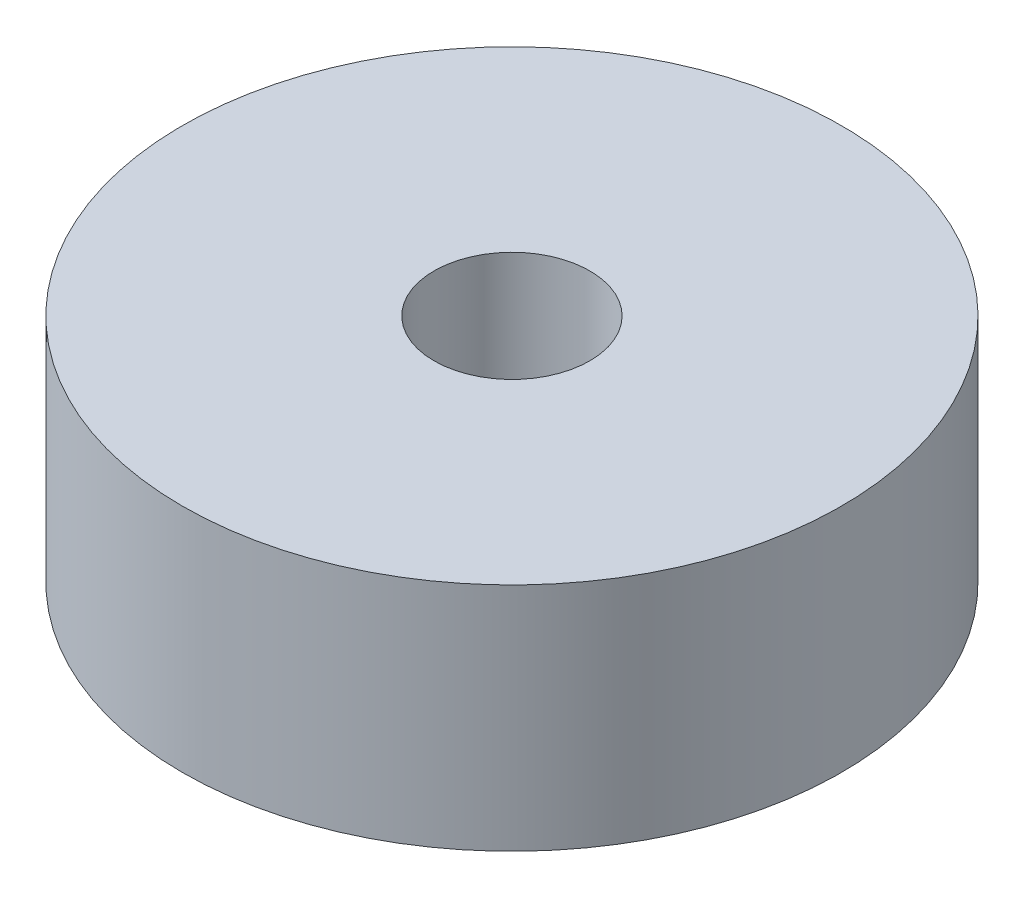
ISO-10303-21;
HEADER;
FILE_DESCRIPTION(('STEP AP214'),'2;1');
FILE_NAME('part.step','',(''),(''),'','','');
FILE_SCHEMA(('AUTOMOTIVE_DESIGN { 1 0 10303 214 1 1 1 1 }'));
ENDSEC;
DATA;
#1=APPLICATION_CONTEXT('core data for automotive mechanical design processes');
#2=APPLICATION_PROTOCOL_DEFINITION('international standard','automotive_design',2000,#1);
#3=PRODUCT_CONTEXT('',#1,'mechanical');
#4=PRODUCT('Part','Part','',(#3));
#5=PRODUCT_RELATED_PRODUCT_CATEGORY('part','',(#4));
#6=PRODUCT_DEFINITION_FORMATION('','',#4);
#7=PRODUCT_DEFINITION_CONTEXT('part definition',#1,'design');
#8=PRODUCT_DEFINITION('design','',#6,#7);
#9=PRODUCT_DEFINITION_SHAPE('','',#8);
#10=(LENGTH_UNIT() NAMED_UNIT(*) SI_UNIT(.MILLI.,.METRE.));
#11=(NAMED_UNIT(*) PLANE_ANGLE_UNIT() SI_UNIT($,.RADIAN.));
#12=(NAMED_UNIT(*) SI_UNIT($,.STERADIAN.) SOLID_ANGLE_UNIT());
#13=UNCERTAINTY_MEASURE_WITH_UNIT(LENGTH_MEASURE(1.E-05),#10,'distance_accuracy_value','');
#14=(GEOMETRIC_REPRESENTATION_CONTEXT(3) GLOBAL_UNCERTAINTY_ASSIGNED_CONTEXT((#13)) GLOBAL_UNIT_ASSIGNED_CONTEXT((#10,
#11,#12)) REPRESENTATION_CONTEXT('',''));
#15=CARTESIAN_POINT('',(0.,0.,0.));
#16=DIRECTION('',(0.,0.,1.));
#17=DIRECTION('',(1.,0.,0.));
#18=AXIS2_PLACEMENT_3D('',#15,#16,#17);
#19=CARTESIAN_POINT('',(0.,0.,0.));
#20=DIRECTION('',(0.,1.,0.));
#21=DIRECTION('',(0.,0.,1.));
#22=AXIS2_PLACEMENT_3D('',#19,#20,#21);
#23=PLANE('',#22);
#24=CARTESIAN_POINT('',(0.,0.,0.));
#25=DIRECTION('',(0.,1.,0.));
#26=DIRECTION('',(0.,0.,1.));
#27=AXIS2_PLACEMENT_3D('',#24,#25,#26);
#28=CIRCLE('',#27,14.2875);
#29=CARTESIAN_POINT('',(0.,0.,14.2875));
#30=VERTEX_POINT('',#29);
#31=EDGE_CURVE('E41',#30,#30,#28,.T.);
#32=ORIENTED_EDGE('',*,*,#31,.F.);
#33=EDGE_LOOP('',(#32));
#34=FACE_BOUND('',#33,.T.);
#35=CARTESIAN_POINT('',(0.,0.,0.));
#36=DIRECTION('',(0.,1.,0.));
#37=DIRECTION('',(0.,0.,1.));
#38=AXIS2_PLACEMENT_3D('',#35,#36,#37);
#39=CIRCLE('',#38,3.3782);
#40=CARTESIAN_POINT('',(0.,0.,3.3782));
#41=VERTEX_POINT('',#40);
#42=EDGE_CURVE('E48',#41,#41,#39,.F.);
#43=ORIENTED_EDGE('',*,*,#42,.F.);
#44=EDGE_LOOP('',(#43));
#45=FACE_BOUND('',#44,.T.);
#46=ADVANCED_FACE('F37',(#34,#45),#23,.F.);
#47=CARTESIAN_POINT('',(0.,10.,0.));
#48=DIRECTION('',(0.,-1.,0.));
#49=DIRECTION('',(0.,0.,-1.));
#50=AXIS2_PLACEMENT_3D('',#47,#48,#49);
#51=CYLINDRICAL_SURFACE('',#50,14.2875);
#52=CARTESIAN_POINT('',(0.,10.,0.));
#53=DIRECTION('',(0.,1.,0.));
#54=DIRECTION('',(0.,0.,1.));
#55=AXIS2_PLACEMENT_3D('',#52,#53,#54);
#56=CIRCLE('',#55,14.2875);
#57=CARTESIAN_POINT('',(0.,10.,14.2875));
#58=VERTEX_POINT('',#57);
#59=EDGE_CURVE('E10',#58,#58,#56,.T.);
#60=ORIENTED_EDGE('',*,*,#59,.F.);
#61=EDGE_LOOP('',(#60));
#62=FACE_BOUND('',#61,.T.);
#63=ORIENTED_EDGE('',*,*,#31,.T.);
#64=EDGE_LOOP('',(#63));
#65=FACE_BOUND('',#64,.T.);
#66=ADVANCED_FACE('F39',(#62,#65),#51,.T.);
#67=CARTESIAN_POINT('',(0.,10.,0.));
#68=DIRECTION('',(0.,1.,0.));
#69=DIRECTION('',(0.,0.,1.));
#70=AXIS2_PLACEMENT_3D('',#67,#68,#69);
#71=PLANE('',#70);
#72=CARTESIAN_POINT('',(0.,10.,0.));
#73=DIRECTION('',(0.,1.,0.));
#74=DIRECTION('',(0.,0.,1.));
#75=AXIS2_PLACEMENT_3D('',#72,#73,#74);
#76=CIRCLE('',#75,3.3782);
#77=CARTESIAN_POINT('',(0.,10.,3.3782));
#78=VERTEX_POINT('',#77);
#79=EDGE_CURVE('E50',#78,#78,#76,.T.);
#80=ORIENTED_EDGE('',*,*,#79,.F.);
#81=EDGE_LOOP('',(#80));
#82=FACE_BOUND('',#81,.T.);
#83=ORIENTED_EDGE('',*,*,#59,.T.);
#84=EDGE_LOOP('',(#83));
#85=FACE_BOUND('',#84,.T.);
#86=ADVANCED_FACE('F65',(#82,#85),#71,.T.);
#87=CARTESIAN_POINT('',(0.,10.,0.));
#88=DIRECTION('',(0.,1.,0.));
#89=DIRECTION('',(0.,0.,1.));
#90=AXIS2_PLACEMENT_3D('',#87,#88,#89);
#91=CYLINDRICAL_SURFACE('',#90,3.3782);
#92=ORIENTED_EDGE('',*,*,#42,.T.);
#93=EDGE_LOOP('',(#92));
#94=FACE_BOUND('',#93,.T.);
#95=ORIENTED_EDGE('',*,*,#79,.T.);
#96=EDGE_LOOP('',(#95));
#97=FACE_BOUND('',#96,.T.);
#98=ADVANCED_FACE('F56',(#94,#97),#91,.F.);
#99=CLOSED_SHELL('',(#46,#66,#86,#98));
#100=MANIFOLD_SOLID_BREP('B2',#99);
#101=ADVANCED_BREP_SHAPE_REPRESENTATION('',(#18,#100),#14);
#102=SHAPE_DEFINITION_REPRESENTATION(#9,#101);
ENDSEC;
END-ISO-10303-21;
